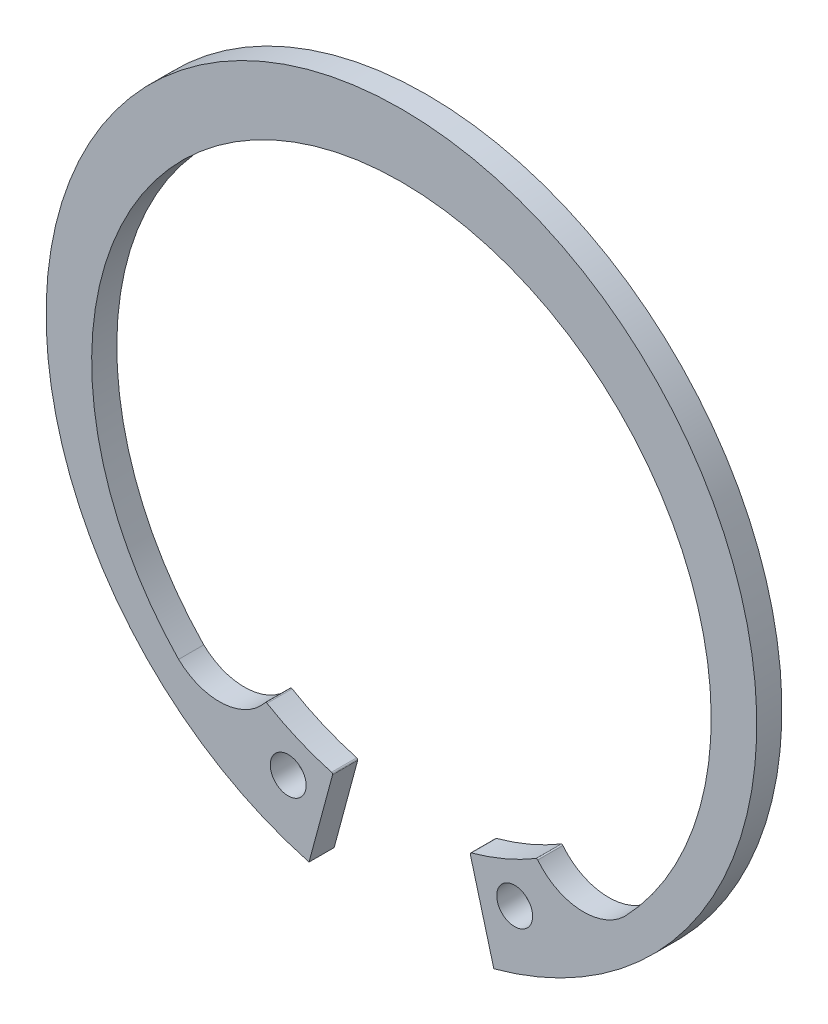
ISO-10303-21;
HEADER;
FILE_DESCRIPTION(('STEP AP214'),'2;1');
FILE_NAME('part.step','',(''),(''),'','','');
FILE_SCHEMA(('AUTOMOTIVE_DESIGN { 1 0 10303 214 1 1 1 1 }'));
ENDSEC;
DATA;
#1=APPLICATION_CONTEXT('core data for automotive mechanical design processes');
#2=APPLICATION_PROTOCOL_DEFINITION('international standard','automotive_design',2000,#1);
#3=PRODUCT_CONTEXT('',#1,'mechanical');
#4=PRODUCT('Part','Part','',(#3));
#5=PRODUCT_RELATED_PRODUCT_CATEGORY('part','',(#4));
#6=PRODUCT_DEFINITION_FORMATION('','',#4);
#7=PRODUCT_DEFINITION_CONTEXT('part definition',#1,'design');
#8=PRODUCT_DEFINITION('design','',#6,#7);
#9=PRODUCT_DEFINITION_SHAPE('','',#8);
#10=(LENGTH_UNIT() NAMED_UNIT(*) SI_UNIT(.MILLI.,.METRE.));
#11=(NAMED_UNIT(*) PLANE_ANGLE_UNIT() SI_UNIT($,.RADIAN.));
#12=(NAMED_UNIT(*) SI_UNIT($,.STERADIAN.) SOLID_ANGLE_UNIT());
#13=UNCERTAINTY_MEASURE_WITH_UNIT(LENGTH_MEASURE(1.E-05),#10,'distance_accuracy_value','');
#14=(GEOMETRIC_REPRESENTATION_CONTEXT(3) GLOBAL_UNCERTAINTY_ASSIGNED_CONTEXT((#13)) GLOBAL_UNIT_ASSIGNED_CONTEXT((#10,
#11,#12)) REPRESENTATION_CONTEXT('',''));
#15=CARTESIAN_POINT('',(0.,0.,0.));
#16=DIRECTION('',(0.,0.,1.));
#17=DIRECTION('',(1.,0.,0.));
#18=AXIS2_PLACEMENT_3D('',#15,#16,#17);
#19=CARTESIAN_POINT('',(0.,0.,-1.75));
#20=DIRECTION('',(0.,0.,1.));
#21=DIRECTION('',(1.,0.,0.));
#22=AXIS2_PLACEMENT_3D('',#19,#20,#21);
#23=CYLINDRICAL_SURFACE('',#22,24.75);
#24=CARTESIAN_POINT('',(0.,0.,-1.75));
#25=DIRECTION('',(0.,0.,1.));
#26=DIRECTION('',(1.,0.,0.));
#27=AXIS2_PLACEMENT_3D('',#24,#25,#26);
#28=CIRCLE('',#27,24.75);
#29=CARTESIAN_POINT('',(6.43611165244911,-23.8985139035298,-1.75));
#30=VERTEX_POINT('',#29);
#31=CARTESIAN_POINT('',(-6.43611165244911,-23.8985139035298,-1.75));
#32=VERTEX_POINT('',#31);
#33=EDGE_CURVE('E48',#30,#32,#28,.T.);
#34=ORIENTED_EDGE('',*,*,#33,.T.);
#35=DIRECTION('',(0.,0.,1.));
#36=VECTOR('',#35,1.);
#37=CARTESIAN_POINT('',(-6.43611165244911,-23.8985139035298,-1.75));
#38=LINE('',#37,#36);
#39=CARTESIAN_POINT('',(-6.43611165244911,-23.8985139035298,0.));
#40=VERTEX_POINT('',#39);
#41=EDGE_CURVE('E35',#32,#40,#38,.T.);
#42=ORIENTED_EDGE('',*,*,#41,.T.);
#43=CARTESIAN_POINT('',(0.,0.,0.));
#44=DIRECTION('',(0.,0.,1.));
#45=DIRECTION('',(1.,0.,0.));
#46=AXIS2_PLACEMENT_3D('',#43,#44,#45);
#47=CIRCLE('',#46,24.75);
#48=CARTESIAN_POINT('',(6.43611165244911,-23.8985139035298,0.));
#49=VERTEX_POINT('',#48);
#50=EDGE_CURVE('E137',#49,#40,#47,.T.);
#51=ORIENTED_EDGE('',*,*,#50,.F.);
#52=DIRECTION('',(0.,0.,1.));
#53=VECTOR('',#52,1.);
#54=CARTESIAN_POINT('',(6.43611165244911,-23.8985139035298,-1.75));
#55=LINE('',#54,#53);
#56=EDGE_CURVE('E11',#30,#49,#55,.T.);
#57=ORIENTED_EDGE('',*,*,#56,.F.);
#58=EDGE_LOOP('',(#34,#42,#51,#57));
#59=FACE_BOUND('',#58,.T.);
#60=ADVANCED_FACE('F32',(#59),#23,.T.);
#61=CARTESIAN_POINT('',(6.43611165244911,-23.8985139035298,-1.75));
#62=DIRECTION('',(-0.965596521354741,-0.260044915250469,0.));
#63=DIRECTION('',(0.260044915250469,-0.965596521354741,0.));
#64=AXIS2_PLACEMENT_3D('',#61,#62,#63);
#65=PLANE('',#64);
#66=DIRECTION('',(0.260044915250469,-0.965596521354741,0.));
#67=VECTOR('',#66,1.);
#68=CARTESIAN_POINT('',(6.43611165244911,-23.8985139035298,0.));
#69=LINE('',#68,#67);
#70=CARTESIAN_POINT('',(4.79775821297681,-17.814994137799,0.));
#71=VERTEX_POINT('',#70);
#72=EDGE_CURVE('E245',#71,#49,#69,.T.);
#73=ORIENTED_EDGE('',*,*,#72,.F.);
#74=DIRECTION('',(0.,0.,1.));
#75=VECTOR('',#74,1.);
#76=CARTESIAN_POINT('',(4.79775821297681,-17.814994137799,-1.75));
#77=LINE('',#76,#75);
#78=CARTESIAN_POINT('',(4.79775821297681,-17.814994137799,-1.75));
#79=VERTEX_POINT('',#78);
#80=EDGE_CURVE('E215',#79,#71,#77,.T.);
#81=ORIENTED_EDGE('',*,*,#80,.F.);
#82=DIRECTION('',(0.260044915250469,-0.965596521354741,0.));
#83=VECTOR('',#82,1.);
#84=CARTESIAN_POINT('',(6.43611165244911,-23.8985139035298,-1.75));
#85=LINE('',#84,#83);
#86=EDGE_CURVE('E251',#79,#30,#85,.T.);
#87=ORIENTED_EDGE('',*,*,#86,.T.);
#88=ORIENTED_EDGE('',*,*,#56,.T.);
#89=EDGE_LOOP('',(#73,#81,#87,#88));
#90=FACE_BOUND('',#89,.T.);
#91=ADVANCED_FACE('F300',(#90),#65,.T.);
#92=CARTESIAN_POINT('',(0.,-1.22542652111631,-1.75));
#93=DIRECTION('',(0.,0.,1.));
#94=DIRECTION('',(1.,0.,0.));
#95=AXIS2_PLACEMENT_3D('',#92,#93,#94);
#96=CYLINDRICAL_SURFACE('',#95,21.5754265211163);
#97=DIRECTION('',(0.,0.,1.));
#98=VECTOR('',#97,1.);
#99=CARTESIAN_POINT('',(-15.5200012228605,-16.213041128201,-1.75));
#100=LINE('',#99,#98);
#101=CARTESIAN_POINT('',(-15.5200012228605,-16.213041128201,-1.75));
#102=VERTEX_POINT('',#101);
#103=CARTESIAN_POINT('',(-15.5200012228605,-16.213041128201,0.));
#104=VERTEX_POINT('',#103);
#105=EDGE_CURVE('E180',#102,#104,#100,.T.);
#106=ORIENTED_EDGE('',*,*,#105,.F.);
#107=CARTESIAN_POINT('',(0.,-1.22542652111631,-1.75));
#108=DIRECTION('',(0.,0.,-1.));
#109=DIRECTION('',(1.,0.,0.));
#110=AXIS2_PLACEMENT_3D('',#107,#108,#109);
#111=CIRCLE('',#110,21.5754265211163);
#112=CARTESIAN_POINT('',(15.5200012228605,-16.213041128201,-1.75));
#113=VERTEX_POINT('',#112);
#114=EDGE_CURVE('E249',#102,#113,#111,.T.);
#115=ORIENTED_EDGE('',*,*,#114,.T.);
#116=DIRECTION('',(0.,0.,1.));
#117=VECTOR('',#116,1.);
#118=CARTESIAN_POINT('',(15.5200012228605,-16.213041128201,-1.75));
#119=LINE('',#118,#117);
#120=CARTESIAN_POINT('',(15.5200012228605,-16.213041128201,0.));
#121=VERTEX_POINT('',#120);
#122=EDGE_CURVE('E218',#121,#113,#119,.F.);
#123=ORIENTED_EDGE('',*,*,#122,.F.);
#124=CARTESIAN_POINT('',(0.,-1.22542652111631,0.));
#125=DIRECTION('',(0.,0.,-1.));
#126=DIRECTION('',(1.,0.,0.));
#127=AXIS2_PLACEMENT_3D('',#124,#125,#126);
#128=CIRCLE('',#127,21.5754265211163);
#129=EDGE_CURVE('E139',#104,#121,#128,.T.);
#130=ORIENTED_EDGE('',*,*,#129,.F.);
#131=EDGE_LOOP('',(#106,#115,#123,#130));
#132=FACE_BOUND('',#131,.T.);
#133=ADVANCED_FACE('F279',(#132),#96,.F.);
#134=CARTESIAN_POINT('',(-6.43611165244911,-23.8985139035298,-1.75));
#135=DIRECTION('',(0.965596521354741,-0.260044915250469,0.));
#136=DIRECTION('',(0.260044915250469,0.965596521354741,0.));
#137=AXIS2_PLACEMENT_3D('',#134,#135,#136);
#138=PLANE('',#137);
#139=DIRECTION('',(0.260044915250469,0.965596521354741,0.));
#140=VECTOR('',#139,1.);
#141=CARTESIAN_POINT('',(-6.43611165244911,-23.8985139035298,0.));
#142=LINE('',#141,#140);
#143=CARTESIAN_POINT('',(-4.79775821297681,-17.814994137799,0.));
#144=VERTEX_POINT('',#143);
#145=EDGE_CURVE('E129',#40,#144,#142,.T.);
#146=ORIENTED_EDGE('',*,*,#145,.F.);
#147=ORIENTED_EDGE('',*,*,#41,.F.);
#148=DIRECTION('',(0.260044915250469,0.965596521354741,0.));
#149=VECTOR('',#148,1.);
#150=CARTESIAN_POINT('',(-6.43611165244911,-23.8985139035298,-1.75));
#151=LINE('',#150,#149);
#152=CARTESIAN_POINT('',(-4.79775821297681,-17.814994137799,-1.75));
#153=VERTEX_POINT('',#152);
#154=EDGE_CURVE('E145',#32,#153,#151,.T.);
#155=ORIENTED_EDGE('',*,*,#154,.T.);
#156=DIRECTION('',(0.,0.,1.));
#157=VECTOR('',#156,1.);
#158=CARTESIAN_POINT('',(-4.79775821297681,-17.814994137799,-1.75));
#159=LINE('',#158,#157);
#160=EDGE_CURVE('E142',#153,#144,#159,.T.);
#161=ORIENTED_EDGE('',*,*,#160,.T.);
#162=EDGE_LOOP('',(#146,#147,#155,#161));
#163=FACE_BOUND('',#162,.T.);
#164=ADVANCED_FACE('F143',(#163),#138,.T.);
#165=CARTESIAN_POINT('',(0.,0.,-1.75));
#166=DIRECTION('',(0.,0.,1.));
#167=DIRECTION('',(1.,0.,0.));
#168=AXIS2_PLACEMENT_3D('',#165,#166,#167);
#169=PLANE('',#168);
#170=ORIENTED_EDGE('',*,*,#114,.F.);
#171=DIRECTION('',(-0.691498892900989,-0.722377519802982,0.));
#172=VECTOR('',#171,1.);
#173=CARTESIAN_POINT('',(-17.1145975992995,-17.8788436151238,-1.75));
#174=LINE('',#173,#172);
#175=CARTESIAN_POINT('',(-15.51730565808,-16.2102251939738,-1.75));
#176=VERTEX_POINT('',#175);
#177=EDGE_CURVE('E150',#176,#102,#174,.T.);
#178=ORIENTED_EDGE('',*,*,#177,.F.);
#179=CARTESIAN_POINT('',(-12.6890046847331,-13.2556274883847,-1.75));
#180=DIRECTION('',(0.,0.,-1.));
#181=DIRECTION('',(1.,0.,0.));
#182=AXIS2_PLACEMENT_3D('',#179,#180,#181);
#183=CIRCLE('',#182,4.09010195443912);
#184=CARTESIAN_POINT('',(-9.49123336413031,-15.8057632845408,-1.75));
#185=VERTEX_POINT('',#184);
#186=EDGE_CURVE('E174',#185,#176,#183,.T.);
#187=ORIENTED_EDGE('',*,*,#186,.F.);
#188=CARTESIAN_POINT('',(-9.41305019519653,-15.868112238786,-1.75));
#189=DIRECTION('',(0.,0.,1.));
#190=DIRECTION('',(1.,0.,0.));
#191=AXIS2_PLACEMENT_3D('',#188,#189,#190);
#192=CIRCLE('',#191,0.100000000000002);
#193=CARTESIAN_POINT('',(-9.36203095294614,-15.7821062103915,-1.75));
#194=VERTEX_POINT('',#193);
#195=EDGE_CURVE('E171',#194,#185,#192,.T.);
#196=ORIENTED_EDGE('',*,*,#195,.F.);
#197=CARTESIAN_POINT('',(0.,0.,-1.75));
#198=DIRECTION('',(0.,0.,-1.));
#199=DIRECTION('',(1.,0.,0.));
#200=AXIS2_PLACEMENT_3D('',#197,#198,#199);
#201=CIRCLE('',#200,18.35);
#202=CARTESIAN_POINT('',(-4.8677903970087,-17.6925723582183,-1.75));
#203=VERTEX_POINT('',#202);
#204=EDGE_CURVE('E169',#203,#194,#201,.T.);
#205=ORIENTED_EDGE('',*,*,#204,.F.);
#206=CARTESIAN_POINT('',(-4.89431786511229,-17.788989646274,-1.75));
#207=DIRECTION('',(0.,0.,1.));
#208=DIRECTION('',(-1.,0.,0.));
#209=AXIS2_PLACEMENT_3D('',#206,#207,#208);
#210=CIRCLE('',#209,0.0999999999999998);
#211=EDGE_CURVE('E167',#153,#203,#210,.T.);
#212=ORIENTED_EDGE('',*,*,#211,.F.);
#213=ORIENTED_EDGE('',*,*,#154,.F.);
#214=ORIENTED_EDGE('',*,*,#33,.F.);
#215=ORIENTED_EDGE('',*,*,#86,.F.);
#216=CARTESIAN_POINT('',(4.89431786511229,-17.788989646274,-1.75));
#217=DIRECTION('',(0.,0.,1.));
#218=DIRECTION('',(1.,0.,0.));
#219=AXIS2_PLACEMENT_3D('',#216,#217,#218);
#220=CIRCLE('',#219,0.100000000000001);
#221=CARTESIAN_POINT('',(4.8677903970087,-17.6925723582183,-1.75));
#222=VERTEX_POINT('',#221);
#223=EDGE_CURVE('E211',#222,#79,#220,.T.);
#224=ORIENTED_EDGE('',*,*,#223,.F.);
#225=CARTESIAN_POINT('',(0.,0.,-1.75));
#226=DIRECTION('',(0.,0.,-1.));
#227=DIRECTION('',(1.,0.,0.));
#228=AXIS2_PLACEMENT_3D('',#225,#226,#227);
#229=CIRCLE('',#228,18.35);
#230=CARTESIAN_POINT('',(9.36203095294614,-15.7821062103915,-1.75));
#231=VERTEX_POINT('',#230);
#232=EDGE_CURVE('E209',#231,#222,#229,.T.);
#233=ORIENTED_EDGE('',*,*,#232,.F.);
#234=CARTESIAN_POINT('',(9.41305019519653,-15.868112238786,-1.75));
#235=DIRECTION('',(0.,0.,1.));
#236=DIRECTION('',(-1.,0.,0.));
#237=AXIS2_PLACEMENT_3D('',#234,#235,#236);
#238=CIRCLE('',#237,0.100000000000002);
#239=CARTESIAN_POINT('',(9.49123336413031,-15.8057632845408,-1.75));
#240=VERTEX_POINT('',#239);
#241=EDGE_CURVE('E206',#240,#231,#238,.T.);
#242=ORIENTED_EDGE('',*,*,#241,.F.);
#243=CARTESIAN_POINT('',(12.6890046847331,-13.2556274883847,-1.75));
#244=DIRECTION('',(0.,0.,-1.));
#245=DIRECTION('',(1.,0.,0.));
#246=AXIS2_PLACEMENT_3D('',#243,#244,#245);
#247=CIRCLE('',#246,4.09010195443912);
#248=CARTESIAN_POINT('',(15.51730565808,-16.2102251939738,-1.75));
#249=VERTEX_POINT('',#248);
#250=EDGE_CURVE('E203',#249,#240,#247,.T.);
#251=ORIENTED_EDGE('',*,*,#250,.F.);
#252=DIRECTION('',(-0.691498892900989,0.722377519802982,0.));
#253=VECTOR('',#252,1.);
#254=CARTESIAN_POINT('',(15.51730565808,-16.2102251939738,-1.75));
#255=LINE('',#254,#253);
#256=EDGE_CURVE('E201',#113,#249,#255,.T.);
#257=ORIENTED_EDGE('',*,*,#256,.F.);
#258=EDGE_LOOP('',(#170,#178,#187,#196,#205,#212,#213,#214,#215,#224,#233,#242,#251,#257));
#259=FACE_BOUND('',#258,.T.);
#260=CARTESIAN_POINT('',(7.88649275770018,-19.3819208795914,-1.75));
#261=DIRECTION('',(0.,0.,1.));
#262=DIRECTION('',(1.,0.,0.));
#263=AXIS2_PLACEMENT_3D('',#260,#261,#262);
#264=CIRCLE('',#263,1.25);
#265=CARTESIAN_POINT('',(9.13649275770018,-19.3819208795914,-1.75));
#266=VERTEX_POINT('',#265);
#267=EDGE_CURVE('E240',#266,#266,#264,.T.);
#268=ORIENTED_EDGE('',*,*,#267,.T.);
#269=EDGE_LOOP('',(#268));
#270=FACE_BOUND('',#269,.T.);
#271=CARTESIAN_POINT('',(-7.88649275770018,-19.3819208795914,-1.75));
#272=DIRECTION('',(0.,0.,1.));
#273=DIRECTION('',(1.,0.,0.));
#274=AXIS2_PLACEMENT_3D('',#271,#272,#273);
#275=CIRCLE('',#274,1.25);
#276=CARTESIAN_POINT('',(-6.63649275770018,-19.3819208795914,-1.75));
#277=VERTEX_POINT('',#276);
#278=EDGE_CURVE('E234',#277,#277,#275,.T.);
#279=ORIENTED_EDGE('',*,*,#278,.T.);
#280=EDGE_LOOP('',(#279));
#281=FACE_BOUND('',#280,.T.);
#282=ADVANCED_FACE('F257',(#259,#270,#281),#169,.F.);
#283=CARTESIAN_POINT('',(0.,0.,0.));
#284=DIRECTION('',(0.,0.,1.));
#285=DIRECTION('',(1.,0.,0.));
#286=AXIS2_PLACEMENT_3D('',#283,#284,#285);
#287=PLANE('',#286);
#288=DIRECTION('',(-0.691498892900989,-0.722377519802982,0.));
#289=VECTOR('',#288,1.);
#290=CARTESIAN_POINT('',(-17.1145975992995,-17.8788436151238,0.));
#291=LINE('',#290,#289);
#292=CARTESIAN_POINT('',(-15.51730565808,-16.2102251939738,0.));
#293=VERTEX_POINT('',#292);
#294=EDGE_CURVE('E165',#293,#104,#291,.T.);
#295=ORIENTED_EDGE('',*,*,#294,.T.);
#296=ORIENTED_EDGE('',*,*,#129,.T.);
#297=DIRECTION('',(-0.691498892900989,0.722377519802982,0.));
#298=VECTOR('',#297,1.);
#299=CARTESIAN_POINT('',(15.51730565808,-16.2102251939738,0.));
#300=LINE('',#299,#298);
#301=CARTESIAN_POINT('',(15.51730565808,-16.2102251939738,0.));
#302=VERTEX_POINT('',#301);
#303=EDGE_CURVE('E188',#121,#302,#300,.T.);
#304=ORIENTED_EDGE('',*,*,#303,.T.);
#305=CARTESIAN_POINT('',(12.6890046847331,-13.2556274883847,0.));
#306=DIRECTION('',(0.,0.,-1.));
#307=DIRECTION('',(1.,0.,0.));
#308=AXIS2_PLACEMENT_3D('',#305,#306,#307);
#309=CIRCLE('',#308,4.09010195443912);
#310=CARTESIAN_POINT('',(9.49123336413031,-15.8057632845408,0.));
#311=VERTEX_POINT('',#310);
#312=EDGE_CURVE('E190',#302,#311,#309,.T.);
#313=ORIENTED_EDGE('',*,*,#312,.T.);
#314=CARTESIAN_POINT('',(9.41305019519653,-15.868112238786,0.));
#315=DIRECTION('',(0.,0.,1.));
#316=DIRECTION('',(-1.,0.,0.));
#317=AXIS2_PLACEMENT_3D('',#314,#315,#316);
#318=CIRCLE('',#317,0.100000000000002);
#319=CARTESIAN_POINT('',(9.36203095294614,-15.7821062103915,0.));
#320=VERTEX_POINT('',#319);
#321=EDGE_CURVE('E193',#311,#320,#318,.T.);
#322=ORIENTED_EDGE('',*,*,#321,.T.);
#323=CARTESIAN_POINT('',(0.,0.,0.));
#324=DIRECTION('',(0.,0.,-1.));
#325=DIRECTION('',(1.,0.,0.));
#326=AXIS2_PLACEMENT_3D('',#323,#324,#325);
#327=CIRCLE('',#326,18.35);
#328=CARTESIAN_POINT('',(4.8677903970087,-17.6925723582183,0.));
#329=VERTEX_POINT('',#328);
#330=EDGE_CURVE('E196',#320,#329,#327,.T.);
#331=ORIENTED_EDGE('',*,*,#330,.T.);
#332=CARTESIAN_POINT('',(4.89431786511229,-17.788989646274,0.));
#333=DIRECTION('',(0.,0.,1.));
#334=DIRECTION('',(1.,0.,0.));
#335=AXIS2_PLACEMENT_3D('',#332,#333,#334);
#336=CIRCLE('',#335,0.100000000000001);
#337=EDGE_CURVE('E198',#329,#71,#336,.T.);
#338=ORIENTED_EDGE('',*,*,#337,.T.);
#339=ORIENTED_EDGE('',*,*,#72,.T.);
#340=ORIENTED_EDGE('',*,*,#50,.T.);
#341=ORIENTED_EDGE('',*,*,#145,.T.);
#342=CARTESIAN_POINT('',(-4.89431786511229,-17.788989646274,0.));
#343=DIRECTION('',(0.,0.,1.));
#344=DIRECTION('',(-1.,0.,0.));
#345=AXIS2_PLACEMENT_3D('',#342,#343,#344);
#346=CIRCLE('',#345,0.0999999999999998);
#347=CARTESIAN_POINT('',(-4.8677903970087,-17.6925723582183,0.));
#348=VERTEX_POINT('',#347);
#349=EDGE_CURVE('E135',#144,#348,#346,.T.);
#350=ORIENTED_EDGE('',*,*,#349,.T.);
#351=CARTESIAN_POINT('',(0.,0.,0.));
#352=DIRECTION('',(0.,0.,-1.));
#353=DIRECTION('',(1.,0.,0.));
#354=AXIS2_PLACEMENT_3D('',#351,#352,#353);
#355=CIRCLE('',#354,18.35);
#356=CARTESIAN_POINT('',(-9.36203095294614,-15.7821062103915,0.));
#357=VERTEX_POINT('',#356);
#358=EDGE_CURVE('E155',#348,#357,#355,.T.);
#359=ORIENTED_EDGE('',*,*,#358,.T.);
#360=CARTESIAN_POINT('',(-9.41305019519653,-15.868112238786,0.));
#361=DIRECTION('',(0.,0.,1.));
#362=DIRECTION('',(1.,0.,0.));
#363=AXIS2_PLACEMENT_3D('',#360,#361,#362);
#364=CIRCLE('',#363,0.100000000000002);
#365=CARTESIAN_POINT('',(-9.49123336413031,-15.8057632845408,0.));
#366=VERTEX_POINT('',#365);
#367=EDGE_CURVE('E157',#357,#366,#364,.T.);
#368=ORIENTED_EDGE('',*,*,#367,.T.);
#369=CARTESIAN_POINT('',(-12.6890046847331,-13.2556274883847,0.));
#370=DIRECTION('',(0.,0.,-1.));
#371=DIRECTION('',(1.,0.,0.));
#372=AXIS2_PLACEMENT_3D('',#369,#370,#371);
#373=CIRCLE('',#372,4.09010195443912);
#374=EDGE_CURVE('E162',#366,#293,#373,.T.);
#375=ORIENTED_EDGE('',*,*,#374,.T.);
#376=EDGE_LOOP('',(#295,#296,#304,#313,#322,#331,#338,#339,#340,#341,#350,#359,#368,#375));
#377=FACE_BOUND('',#376,.T.);
#378=CARTESIAN_POINT('',(7.88649275770018,-19.3819208795914,0.));
#379=DIRECTION('',(0.,0.,1.));
#380=DIRECTION('',(1.,0.,0.));
#381=AXIS2_PLACEMENT_3D('',#378,#379,#380);
#382=CIRCLE('',#381,1.25);
#383=CARTESIAN_POINT('',(9.13649275770018,-19.3819208795914,0.));
#384=VERTEX_POINT('',#383);
#385=EDGE_CURVE('E237',#384,#384,#382,.T.);
#386=ORIENTED_EDGE('',*,*,#385,.F.);
#387=EDGE_LOOP('',(#386));
#388=FACE_BOUND('',#387,.T.);
#389=CARTESIAN_POINT('',(-7.88649275770018,-19.3819208795914,0.));
#390=DIRECTION('',(0.,0.,1.));
#391=DIRECTION('',(1.,0.,0.));
#392=AXIS2_PLACEMENT_3D('',#389,#390,#391);
#393=CIRCLE('',#392,1.25);
#394=CARTESIAN_POINT('',(-6.63649275770018,-19.3819208795914,0.));
#395=VERTEX_POINT('',#394);
#396=EDGE_CURVE('E231',#395,#395,#393,.T.);
#397=ORIENTED_EDGE('',*,*,#396,.F.);
#398=EDGE_LOOP('',(#397));
#399=FACE_BOUND('',#398,.T.);
#400=ADVANCED_FACE('F132',(#377,#388,#399),#287,.T.);
#401=CARTESIAN_POINT('',(7.88649275770018,-19.3819208795914,-1.75));
#402=DIRECTION('',(0.,0.,1.));
#403=DIRECTION('',(1.,0.,0.));
#404=AXIS2_PLACEMENT_3D('',#401,#402,#403);
#405=CYLINDRICAL_SURFACE('',#404,1.25);
#406=ORIENTED_EDGE('',*,*,#267,.F.);
#407=EDGE_LOOP('',(#406));
#408=FACE_BOUND('',#407,.T.);
#409=ORIENTED_EDGE('',*,*,#385,.T.);
#410=EDGE_LOOP('',(#409));
#411=FACE_BOUND('',#410,.T.);
#412=ADVANCED_FACE('F317',(#408,#411),#405,.F.);
#413=CARTESIAN_POINT('',(-7.88649275770018,-19.3819208795914,-1.75));
#414=DIRECTION('',(0.,0.,1.));
#415=DIRECTION('',(1.,0.,0.));
#416=AXIS2_PLACEMENT_3D('',#413,#414,#415);
#417=CYLINDRICAL_SURFACE('',#416,1.25);
#418=ORIENTED_EDGE('',*,*,#278,.F.);
#419=EDGE_LOOP('',(#418));
#420=FACE_BOUND('',#419,.T.);
#421=ORIENTED_EDGE('',*,*,#396,.T.);
#422=EDGE_LOOP('',(#421));
#423=FACE_BOUND('',#422,.T.);
#424=ADVANCED_FACE('F321',(#420,#423),#417,.F.);
#425=CARTESIAN_POINT('',(0.,0.,-1.75));
#426=DIRECTION('',(0.,0.,1.));
#427=DIRECTION('',(1.,0.,0.));
#428=AXIS2_PLACEMENT_3D('',#425,#426,#427);
#429=CYLINDRICAL_SURFACE('',#428,18.35);
#430=ORIENTED_EDGE('',*,*,#330,.F.);
#431=DIRECTION('',(0.,0.,1.));
#432=VECTOR('',#431,1.);
#433=CARTESIAN_POINT('',(9.36203095294614,-15.7821062103915,-1.75));
#434=LINE('',#433,#432);
#435=EDGE_CURVE('E222',#231,#320,#434,.T.);
#436=ORIENTED_EDGE('',*,*,#435,.F.);
#437=ORIENTED_EDGE('',*,*,#232,.T.);
#438=DIRECTION('',(0.,0.,1.));
#439=VECTOR('',#438,1.);
#440=CARTESIAN_POINT('',(4.8677903970087,-17.6925723582183,-1.75));
#441=LINE('',#440,#439);
#442=EDGE_CURVE('E219',#222,#329,#441,.T.);
#443=ORIENTED_EDGE('',*,*,#442,.T.);
#444=EDGE_LOOP('',(#430,#436,#437,#443));
#445=FACE_BOUND('',#444,.T.);
#446=ADVANCED_FACE('F294',(#445),#429,.F.);
#447=CARTESIAN_POINT('',(4.89431786511229,-17.788989646274,-1.75));
#448=DIRECTION('',(0.,0.,1.));
#449=DIRECTION('',(1.,0.,0.));
#450=AXIS2_PLACEMENT_3D('',#447,#448,#449);
#451=CYLINDRICAL_SURFACE('',#450,0.100000000000001);
#452=ORIENTED_EDGE('',*,*,#337,.F.);
#453=ORIENTED_EDGE('',*,*,#442,.F.);
#454=ORIENTED_EDGE('',*,*,#223,.T.);
#455=ORIENTED_EDGE('',*,*,#80,.T.);
#456=EDGE_LOOP('',(#452,#453,#454,#455));
#457=FACE_BOUND('',#456,.T.);
#458=ADVANCED_FACE('F299',(#457),#451,.T.);
#459=CARTESIAN_POINT('',(9.41305019519653,-15.868112238786,-1.75));
#460=DIRECTION('',(0.,0.,1.));
#461=DIRECTION('',(1.,0.,0.));
#462=AXIS2_PLACEMENT_3D('',#459,#460,#461);
#463=CYLINDRICAL_SURFACE('',#462,0.100000000000002);
#464=ORIENTED_EDGE('',*,*,#321,.F.);
#465=DIRECTION('',(0.,0.,1.));
#466=VECTOR('',#465,1.);
#467=CARTESIAN_POINT('',(9.49123336413031,-15.8057632845408,-1.75));
#468=LINE('',#467,#466);
#469=EDGE_CURVE('E225',#240,#311,#468,.T.);
#470=ORIENTED_EDGE('',*,*,#469,.F.);
#471=ORIENTED_EDGE('',*,*,#241,.T.);
#472=ORIENTED_EDGE('',*,*,#435,.T.);
#473=EDGE_LOOP('',(#464,#470,#471,#472));
#474=FACE_BOUND('',#473,.T.);
#475=ADVANCED_FACE('F291',(#474),#463,.T.);
#476=CARTESIAN_POINT('',(12.6890046847331,-13.2556274883847,-1.75));
#477=DIRECTION('',(0.,0.,1.));
#478=DIRECTION('',(1.,0.,0.));
#479=AXIS2_PLACEMENT_3D('',#476,#477,#478);
#480=CYLINDRICAL_SURFACE('',#479,4.09010195443912);
#481=ORIENTED_EDGE('',*,*,#312,.F.);
#482=DIRECTION('',(0.,0.,1.));
#483=VECTOR('',#482,1.);
#484=CARTESIAN_POINT('',(15.51730565808,-16.2102251939738,-1.75));
#485=LINE('',#484,#483);
#486=EDGE_CURVE('E214',#249,#302,#485,.T.);
#487=ORIENTED_EDGE('',*,*,#486,.F.);
#488=ORIENTED_EDGE('',*,*,#250,.T.);
#489=ORIENTED_EDGE('',*,*,#469,.T.);
#490=EDGE_LOOP('',(#481,#487,#488,#489));
#491=FACE_BOUND('',#490,.T.);
#492=ADVANCED_FACE('F288',(#491),#480,.F.);
#493=CARTESIAN_POINT('',(15.51730565808,-16.2102251939738,-1.75));
#494=DIRECTION('',(0.722377519802982,0.691498892900989,0.));
#495=DIRECTION('',(-0.691498892900989,0.722377519802982,0.));
#496=AXIS2_PLACEMENT_3D('',#493,#494,#495);
#497=PLANE('',#496);
#498=ORIENTED_EDGE('',*,*,#303,.F.);
#499=ORIENTED_EDGE('',*,*,#122,.T.);
#500=ORIENTED_EDGE('',*,*,#256,.T.);
#501=ORIENTED_EDGE('',*,*,#486,.T.);
#502=EDGE_LOOP('',(#498,#499,#500,#501));
#503=FACE_BOUND('',#502,.T.);
#504=ADVANCED_FACE('F282',(#503),#497,.T.);
#505=CARTESIAN_POINT('',(0.,0.,-1.75));
#506=DIRECTION('',(0.,0.,1.));
#507=DIRECTION('',(1.,0.,0.));
#508=AXIS2_PLACEMENT_3D('',#505,#506,#507);
#509=CYLINDRICAL_SURFACE('',#508,18.35);
#510=ORIENTED_EDGE('',*,*,#358,.F.);
#511=DIRECTION('',(0.,0.,1.));
#512=VECTOR('',#511,1.);
#513=CARTESIAN_POINT('',(-4.8677903970087,-17.6925723582183,-1.75));
#514=LINE('',#513,#512);
#515=EDGE_CURVE('E149',#203,#348,#514,.T.);
#516=ORIENTED_EDGE('',*,*,#515,.F.);
#517=ORIENTED_EDGE('',*,*,#204,.T.);
#518=DIRECTION('',(0.,0.,1.));
#519=VECTOR('',#518,1.);
#520=CARTESIAN_POINT('',(-9.36203095294614,-15.7821062103915,-1.75));
#521=LINE('',#520,#519);
#522=EDGE_CURVE('E183',#194,#357,#521,.T.);
#523=ORIENTED_EDGE('',*,*,#522,.T.);
#524=EDGE_LOOP('',(#510,#516,#517,#523));
#525=FACE_BOUND('',#524,.T.);
#526=ADVANCED_FACE('F263',(#525),#509,.F.);
#527=CARTESIAN_POINT('',(-17.1145975992995,-17.8788436151238,-1.75));
#528=DIRECTION('',(-0.722377519802982,0.691498892900989,0.));
#529=DIRECTION('',(-0.691498892900989,-0.722377519802982,0.));
#530=AXIS2_PLACEMENT_3D('',#527,#528,#529);
#531=PLANE('',#530);
#532=ORIENTED_EDGE('',*,*,#177,.T.);
#533=ORIENTED_EDGE('',*,*,#105,.T.);
#534=ORIENTED_EDGE('',*,*,#294,.F.);
#535=DIRECTION('',(0.,0.,1.));
#536=VECTOR('',#535,1.);
#537=CARTESIAN_POINT('',(-15.51730565808,-16.2102251939738,-1.75));
#538=LINE('',#537,#536);
#539=EDGE_CURVE('E178',#176,#293,#538,.T.);
#540=ORIENTED_EDGE('',*,*,#539,.F.);
#541=EDGE_LOOP('',(#532,#533,#534,#540));
#542=FACE_BOUND('',#541,.T.);
#543=ADVANCED_FACE('F273',(#542),#531,.T.);
#544=CARTESIAN_POINT('',(-12.6890046847331,-13.2556274883847,-1.75));
#545=DIRECTION('',(0.,0.,1.));
#546=DIRECTION('',(1.,0.,0.));
#547=AXIS2_PLACEMENT_3D('',#544,#545,#546);
#548=CYLINDRICAL_SURFACE('',#547,4.09010195443912);
#549=ORIENTED_EDGE('',*,*,#374,.F.);
#550=DIRECTION('',(0.,0.,1.));
#551=VECTOR('',#550,1.);
#552=CARTESIAN_POINT('',(-9.49123336413031,-15.8057632845408,-1.75));
#553=LINE('',#552,#551);
#554=EDGE_CURVE('E181',#185,#366,#553,.T.);
#555=ORIENTED_EDGE('',*,*,#554,.F.);
#556=ORIENTED_EDGE('',*,*,#186,.T.);
#557=ORIENTED_EDGE('',*,*,#539,.T.);
#558=EDGE_LOOP('',(#549,#555,#556,#557));
#559=FACE_BOUND('',#558,.T.);
#560=ADVANCED_FACE('F270',(#559),#548,.F.);
#561=CARTESIAN_POINT('',(-9.41305019519653,-15.868112238786,-1.75));
#562=DIRECTION('',(0.,0.,1.));
#563=DIRECTION('',(1.,0.,0.));
#564=AXIS2_PLACEMENT_3D('',#561,#562,#563);
#565=CYLINDRICAL_SURFACE('',#564,0.100000000000002);
#566=ORIENTED_EDGE('',*,*,#367,.F.);
#567=ORIENTED_EDGE('',*,*,#522,.F.);
#568=ORIENTED_EDGE('',*,*,#195,.T.);
#569=ORIENTED_EDGE('',*,*,#554,.T.);
#570=EDGE_LOOP('',(#566,#567,#568,#569));
#571=FACE_BOUND('',#570,.T.);
#572=ADVANCED_FACE('F268',(#571),#565,.T.);
#573=CARTESIAN_POINT('',(-4.89431786511229,-17.788989646274,-1.75));
#574=DIRECTION('',(0.,0.,1.));
#575=DIRECTION('',(1.,0.,0.));
#576=AXIS2_PLACEMENT_3D('',#573,#574,#575);
#577=CYLINDRICAL_SURFACE('',#576,0.0999999999999998);
#578=ORIENTED_EDGE('',*,*,#349,.F.);
#579=ORIENTED_EDGE('',*,*,#160,.F.);
#580=ORIENTED_EDGE('',*,*,#211,.T.);
#581=ORIENTED_EDGE('',*,*,#515,.T.);
#582=EDGE_LOOP('',(#578,#579,#580,#581));
#583=FACE_BOUND('',#582,.T.);
#584=ADVANCED_FACE('F153',(#583),#577,.T.);
#585=CLOSED_SHELL('',(#60,#91,#133,#164,#282,#400,#412,#424,#446,#458,#475,#492,#504,#526,#543,
#560,#572,#584));
#586=MANIFOLD_SOLID_BREP('B2',#585);
#587=ADVANCED_BREP_SHAPE_REPRESENTATION('',(#18,#586),#14);
#588=SHAPE_DEFINITION_REPRESENTATION(#9,#587);
ENDSEC;
END-ISO-10303-21;
